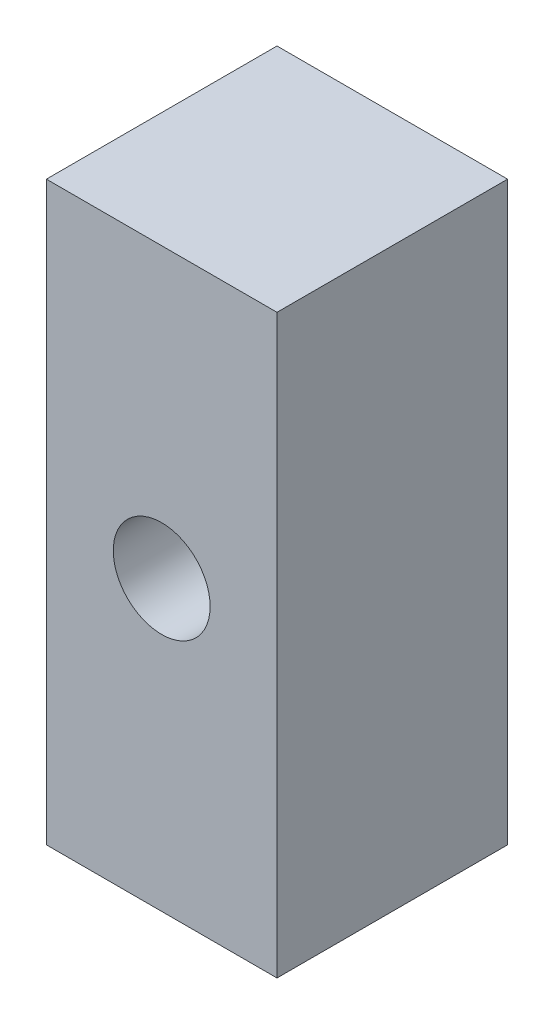
ISO-10303-21;
HEADER;
FILE_DESCRIPTION(('STEP AP214'),'2;1');
FILE_NAME('part.step','',(''),(''),'','','');
FILE_SCHEMA(('AUTOMOTIVE_DESIGN { 1 0 10303 214 1 1 1 1 }'));
ENDSEC;
DATA;
#1=APPLICATION_CONTEXT('core data for automotive mechanical design processes');
#2=APPLICATION_PROTOCOL_DEFINITION('international standard','automotive_design',2000,#1);
#3=PRODUCT_CONTEXT('',#1,'mechanical');
#4=PRODUCT('Part','Part','',(#3));
#5=PRODUCT_RELATED_PRODUCT_CATEGORY('part','',(#4));
#6=PRODUCT_DEFINITION_FORMATION('','',#4);
#7=PRODUCT_DEFINITION_CONTEXT('part definition',#1,'design');
#8=PRODUCT_DEFINITION('design','',#6,#7);
#9=PRODUCT_DEFINITION_SHAPE('','',#8);
#10=(LENGTH_UNIT() NAMED_UNIT(*) SI_UNIT(.MILLI.,.METRE.));
#11=(NAMED_UNIT(*) PLANE_ANGLE_UNIT() SI_UNIT($,.RADIAN.));
#12=(NAMED_UNIT(*) SI_UNIT($,.STERADIAN.) SOLID_ANGLE_UNIT());
#13=UNCERTAINTY_MEASURE_WITH_UNIT(LENGTH_MEASURE(1.E-05),#10,'distance_accuracy_value','');
#14=(GEOMETRIC_REPRESENTATION_CONTEXT(3) GLOBAL_UNCERTAINTY_ASSIGNED_CONTEXT((#13)) GLOBAL_UNIT_ASSIGNED_CONTEXT((#10,
#11,#12)) REPRESENTATION_CONTEXT('',''));
#15=CARTESIAN_POINT('',(0.,0.,0.));
#16=DIRECTION('',(0.,0.,1.));
#17=DIRECTION('',(1.,0.,0.));
#18=AXIS2_PLACEMENT_3D('',#15,#16,#17);
#19=CARTESIAN_POINT('',(0.,0.,5.));
#20=DIRECTION('',(0.,0.,1.));
#21=DIRECTION('',(1.,0.,0.));
#22=AXIS2_PLACEMENT_3D('',#19,#20,#21);
#23=CYLINDRICAL_SURFACE('',#22,2.1);
#24=CARTESIAN_POINT('',(0.,0.,-5.));
#25=DIRECTION('',(0.,0.,1.));
#26=DIRECTION('',(1.,0.,0.));
#27=AXIS2_PLACEMENT_3D('',#24,#25,#26);
#28=CIRCLE('',#27,2.1);
#29=CARTESIAN_POINT('',(2.1,0.,-5.));
#30=VERTEX_POINT('',#29);
#31=EDGE_CURVE('E73',#30,#30,#28,.F.);
#32=ORIENTED_EDGE('',*,*,#31,.T.);
#33=EDGE_LOOP('',(#32));
#34=FACE_BOUND('',#33,.T.);
#35=CARTESIAN_POINT('',(0.,0.,5.));
#36=DIRECTION('',(0.,0.,1.));
#37=DIRECTION('',(1.,0.,0.));
#38=AXIS2_PLACEMENT_3D('',#35,#36,#37);
#39=CIRCLE('',#38,2.1);
#40=CARTESIAN_POINT('',(2.1,0.,5.));
#41=VERTEX_POINT('',#40);
#42=EDGE_CURVE('E20',#41,#41,#39,.T.);
#43=ORIENTED_EDGE('',*,*,#42,.T.);
#44=EDGE_LOOP('',(#43));
#45=FACE_BOUND('',#44,.T.);
#46=ADVANCED_FACE('F17',(#34,#45),#23,.F.);
#47=CARTESIAN_POINT('',(-5.,12.5,5.));
#48=DIRECTION('',(1.,0.,0.));
#49=DIRECTION('',(0.,0.,-1.));
#50=AXIS2_PLACEMENT_3D('',#47,#48,#49);
#51=PLANE('',#50);
#52=DIRECTION('',(0.,1.,0.));
#53=VECTOR('',#52,1.);
#54=CARTESIAN_POINT('',(-5.,12.5,5.));
#55=LINE('',#54,#53);
#56=CARTESIAN_POINT('',(-5.,-12.5,5.));
#57=VERTEX_POINT('',#56);
#58=CARTESIAN_POINT('',(-5.,12.5,5.));
#59=VERTEX_POINT('',#58);
#60=EDGE_CURVE('E58',#57,#59,#55,.T.);
#61=ORIENTED_EDGE('',*,*,#60,.T.);
#62=DIRECTION('',(0.,0.,-1.));
#63=VECTOR('',#62,1.);
#64=CARTESIAN_POINT('',(-5.,12.5,0.));
#65=LINE('',#64,#63);
#66=CARTESIAN_POINT('',(-5.,12.5,-5.));
#67=VERTEX_POINT('',#66);
#68=EDGE_CURVE('E55',#59,#67,#65,.T.);
#69=ORIENTED_EDGE('',*,*,#68,.T.);
#70=DIRECTION('',(0.,1.,0.));
#71=VECTOR('',#70,1.);
#72=CARTESIAN_POINT('',(-5.,12.5,-5.));
#73=LINE('',#72,#71);
#74=CARTESIAN_POINT('',(-5.,-12.5,-5.));
#75=VERTEX_POINT('',#74);
#76=EDGE_CURVE('E84',#67,#75,#73,.F.);
#77=ORIENTED_EDGE('',*,*,#76,.T.);
#78=DIRECTION('',(0.,0.,-1.));
#79=VECTOR('',#78,1.);
#80=CARTESIAN_POINT('',(-5.,-12.5,0.));
#81=LINE('',#80,#79);
#82=EDGE_CURVE('E60',#57,#75,#81,.T.);
#83=ORIENTED_EDGE('',*,*,#82,.F.);
#84=EDGE_LOOP('',(#61,#69,#77,#83));
#85=FACE_BOUND('',#84,.T.);
#86=ADVANCED_FACE('F59',(#85),#51,.F.);
#87=CARTESIAN_POINT('',(-5.,12.5,5.));
#88=DIRECTION('',(0.,0.,-1.));
#89=DIRECTION('',(-1.,0.,0.));
#90=AXIS2_PLACEMENT_3D('',#87,#88,#89);
#91=PLANE('',#90);
#92=DIRECTION('',(0.,1.,0.));
#93=VECTOR('',#92,1.);
#94=CARTESIAN_POINT('',(5.,12.5,5.));
#95=LINE('',#94,#93);
#96=CARTESIAN_POINT('',(5.,-12.5,5.));
#97=VERTEX_POINT('',#96);
#98=CARTESIAN_POINT('',(5.,12.5,5.));
#99=VERTEX_POINT('',#98);
#100=EDGE_CURVE('E78',#97,#99,#95,.T.);
#101=ORIENTED_EDGE('',*,*,#100,.T.);
#102=DIRECTION('',(1.,0.,0.));
#103=VECTOR('',#102,1.);
#104=CARTESIAN_POINT('',(0.,12.5,5.));
#105=LINE('',#104,#103);
#106=EDGE_CURVE('E65',#99,#59,#105,.F.);
#107=ORIENTED_EDGE('',*,*,#106,.T.);
#108=ORIENTED_EDGE('',*,*,#60,.F.);
#109=DIRECTION('',(1.,0.,0.));
#110=VECTOR('',#109,1.);
#111=CARTESIAN_POINT('',(0.,-12.5,5.));
#112=LINE('',#111,#110);
#113=EDGE_CURVE('E85',#97,#57,#112,.F.);
#114=ORIENTED_EDGE('',*,*,#113,.F.);
#115=EDGE_LOOP('',(#101,#107,#108,#114));
#116=FACE_BOUND('',#115,.T.);
#117=ORIENTED_EDGE('',*,*,#42,.F.);
#118=EDGE_LOOP('',(#117));
#119=FACE_BOUND('',#118,.T.);
#120=ADVANCED_FACE('F76',(#116,#119),#91,.F.);
#121=CARTESIAN_POINT('',(0.,12.5,0.));
#122=DIRECTION('',(0.,-1.,0.));
#123=DIRECTION('',(0.,0.,-1.));
#124=AXIS2_PLACEMENT_3D('',#121,#122,#123);
#125=PLANE('',#124);
#126=DIRECTION('',(1.,0.,0.));
#127=VECTOR('',#126,1.);
#128=CARTESIAN_POINT('',(-5.,12.5,-5.));
#129=LINE('',#128,#127);
#130=CARTESIAN_POINT('',(5.,12.5,-5.));
#131=VERTEX_POINT('',#130);
#132=EDGE_CURVE('E72',#131,#67,#129,.F.);
#133=ORIENTED_EDGE('',*,*,#132,.T.);
#134=ORIENTED_EDGE('',*,*,#68,.F.);
#135=ORIENTED_EDGE('',*,*,#106,.F.);
#136=DIRECTION('',(0.,0.,1.));
#137=VECTOR('',#136,1.);
#138=CARTESIAN_POINT('',(5.,12.5,5.));
#139=LINE('',#138,#137);
#140=EDGE_CURVE('E92',#99,#131,#139,.F.);
#141=ORIENTED_EDGE('',*,*,#140,.T.);
#142=EDGE_LOOP('',(#133,#134,#135,#141));
#143=FACE_BOUND('',#142,.T.);
#144=ADVANCED_FACE('F69',(#143),#125,.F.);
#145=CARTESIAN_POINT('',(-5.,12.5,-5.));
#146=DIRECTION('',(0.,0.,1.));
#147=DIRECTION('',(1.,0.,0.));
#148=AXIS2_PLACEMENT_3D('',#145,#146,#147);
#149=PLANE('',#148);
#150=ORIENTED_EDGE('',*,*,#76,.F.);
#151=ORIENTED_EDGE('',*,*,#132,.F.);
#152=DIRECTION('',(0.,1.,0.));
#153=VECTOR('',#152,1.);
#154=CARTESIAN_POINT('',(5.,12.5,-5.));
#155=LINE('',#154,#153);
#156=CARTESIAN_POINT('',(5.,-12.5,-5.));
#157=VERTEX_POINT('',#156);
#158=EDGE_CURVE('E26',#131,#157,#155,.F.);
#159=ORIENTED_EDGE('',*,*,#158,.T.);
#160=DIRECTION('',(1.,0.,0.));
#161=VECTOR('',#160,1.);
#162=CARTESIAN_POINT('',(0.,-12.5,-5.));
#163=LINE('',#162,#161);
#164=EDGE_CURVE('E34',#75,#157,#163,.T.);
#165=ORIENTED_EDGE('',*,*,#164,.F.);
#166=EDGE_LOOP('',(#150,#151,#159,#165));
#167=FACE_BOUND('',#166,.T.);
#168=ORIENTED_EDGE('',*,*,#31,.F.);
#169=EDGE_LOOP('',(#168));
#170=FACE_BOUND('',#169,.T.);
#171=ADVANCED_FACE('F97',(#167,#170),#149,.F.);
#172=CARTESIAN_POINT('',(0.,-12.5,0.));
#173=DIRECTION('',(0.,-1.,0.));
#174=DIRECTION('',(0.,0.,-1.));
#175=AXIS2_PLACEMENT_3D('',#172,#173,#174);
#176=PLANE('',#175);
#177=ORIENTED_EDGE('',*,*,#82,.T.);
#178=ORIENTED_EDGE('',*,*,#164,.T.);
#179=DIRECTION('',(0.,0.,1.));
#180=VECTOR('',#179,1.);
#181=CARTESIAN_POINT('',(5.,-12.5,5.));
#182=LINE('',#181,#180);
#183=EDGE_CURVE('E11',#157,#97,#182,.T.);
#184=ORIENTED_EDGE('',*,*,#183,.T.);
#185=ORIENTED_EDGE('',*,*,#113,.T.);
#186=EDGE_LOOP('',(#177,#178,#184,#185));
#187=FACE_BOUND('',#186,.T.);
#188=ADVANCED_FACE('F101',(#187),#176,.T.);
#189=CARTESIAN_POINT('',(5.,12.5,5.));
#190=DIRECTION('',(-1.,0.,0.));
#191=DIRECTION('',(0.,0.,1.));
#192=AXIS2_PLACEMENT_3D('',#189,#190,#191);
#193=PLANE('',#192);
#194=ORIENTED_EDGE('',*,*,#158,.F.);
#195=ORIENTED_EDGE('',*,*,#140,.F.);
#196=ORIENTED_EDGE('',*,*,#100,.F.);
#197=ORIENTED_EDGE('',*,*,#183,.F.);
#198=EDGE_LOOP('',(#194,#195,#196,#197));
#199=FACE_BOUND('',#198,.T.);
#200=ADVANCED_FACE('F100',(#199),#193,.F.);
#201=CLOSED_SHELL('',(#46,#86,#120,#144,#171,#188,#200));
#202=MANIFOLD_SOLID_BREP('B1',#201);
#203=ADVANCED_BREP_SHAPE_REPRESENTATION('',(#18,#202),#14);
#204=SHAPE_DEFINITION_REPRESENTATION(#9,#203);
ENDSEC;
END-ISO-10303-21;
